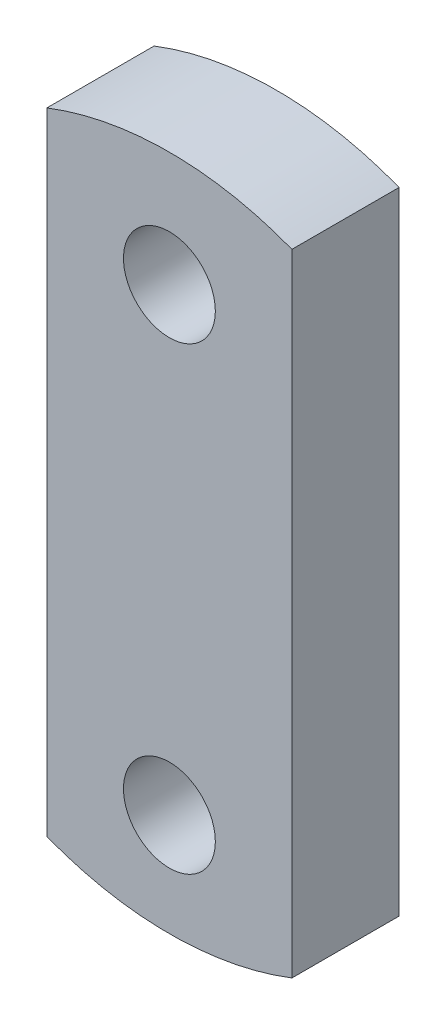
ISO-10303-21;
HEADER;
FILE_DESCRIPTION(('STEP AP214'),'2;1');
FILE_NAME('part.step','',(''),(''),'','','');
FILE_SCHEMA(('AUTOMOTIVE_DESIGN { 1 0 10303 214 1 1 1 1 }'));
ENDSEC;
DATA;
#1=APPLICATION_CONTEXT('core data for automotive mechanical design processes');
#2=APPLICATION_PROTOCOL_DEFINITION('international standard','automotive_design',2000,#1);
#3=PRODUCT_CONTEXT('',#1,'mechanical');
#4=PRODUCT('Part','Part','',(#3));
#5=PRODUCT_RELATED_PRODUCT_CATEGORY('part','',(#4));
#6=PRODUCT_DEFINITION_FORMATION('','',#4);
#7=PRODUCT_DEFINITION_CONTEXT('part definition',#1,'design');
#8=PRODUCT_DEFINITION('design','',#6,#7);
#9=PRODUCT_DEFINITION_SHAPE('','',#8);
#10=(LENGTH_UNIT() NAMED_UNIT(*) SI_UNIT(.MILLI.,.METRE.));
#11=(NAMED_UNIT(*) PLANE_ANGLE_UNIT() SI_UNIT($,.RADIAN.));
#12=(NAMED_UNIT(*) SI_UNIT($,.STERADIAN.) SOLID_ANGLE_UNIT());
#13=UNCERTAINTY_MEASURE_WITH_UNIT(LENGTH_MEASURE(1.E-05),#10,'distance_accuracy_value','');
#14=(GEOMETRIC_REPRESENTATION_CONTEXT(3) GLOBAL_UNCERTAINTY_ASSIGNED_CONTEXT((#13)) GLOBAL_UNIT_ASSIGNED_CONTEXT((#10,
#11,#12)) REPRESENTATION_CONTEXT('',''));
#15=CARTESIAN_POINT('',(0.,0.,0.));
#16=DIRECTION('',(0.,0.,1.));
#17=DIRECTION('',(1.,0.,0.));
#18=AXIS2_PLACEMENT_3D('',#15,#16,#17);
#19=CARTESIAN_POINT('',(0.,1.96104917592106,35.));
#20=DIRECTION('',(0.,0.,-1.));
#21=DIRECTION('',(-1.,0.,0.));
#22=AXIS2_PLACEMENT_3D('',#19,#20,#21);
#23=CYLINDRICAL_SURFACE('',#22,110.524602311905);
#24=CARTESIAN_POINT('',(0.,1.96104917592106,0.));
#25=DIRECTION('',(0.,0.,1.));
#26=DIRECTION('',(1.,0.,0.));
#27=AXIS2_PLACEMENT_3D('',#24,#25,#26);
#28=CIRCLE('',#27,110.524602311905);
#29=CARTESIAN_POINT('',(-40.,-101.071410351186,0.));
#30=VERTEX_POINT('',#29);
#31=CARTESIAN_POINT('',(40.,-101.071410351185,0.));
#32=VERTEX_POINT('',#31);
#33=EDGE_CURVE('E102',#30,#32,#28,.T.);
#34=ORIENTED_EDGE('',*,*,#33,.T.);
#35=DIRECTION('',(0.,0.,-1.));
#36=VECTOR('',#35,1.);
#37=CARTESIAN_POINT('',(40.,-101.071410351185,35.));
#38=LINE('',#37,#36);
#39=CARTESIAN_POINT('',(40.,-101.071410351185,35.));
#40=VERTEX_POINT('',#39);
#41=EDGE_CURVE('E11',#40,#32,#38,.T.);
#42=ORIENTED_EDGE('',*,*,#41,.F.);
#43=CARTESIAN_POINT('',(0.,1.96104917592106,35.));
#44=DIRECTION('',(0.,0.,1.));
#45=DIRECTION('',(1.,0.,0.));
#46=AXIS2_PLACEMENT_3D('',#43,#44,#45);
#47=CIRCLE('',#46,110.524602311905);
#48=CARTESIAN_POINT('',(-40.,-101.071410351186,35.));
#49=VERTEX_POINT('',#48);
#50=EDGE_CURVE('E89',#49,#40,#47,.T.);
#51=ORIENTED_EDGE('',*,*,#50,.F.);
#52=DIRECTION('',(0.,0.,-1.));
#53=VECTOR('',#52,1.);
#54=CARTESIAN_POINT('',(-40.,-101.071410351186,35.));
#55=LINE('',#54,#53);
#56=EDGE_CURVE('E98',#49,#30,#55,.T.);
#57=ORIENTED_EDGE('',*,*,#56,.T.);
#58=EDGE_LOOP('',(#34,#42,#51,#57));
#59=FACE_BOUND('',#58,.T.);
#60=ADVANCED_FACE('F36',(#59),#23,.T.);
#61=CARTESIAN_POINT('',(40.,104.993508703028,35.));
#62=DIRECTION('',(-1.,0.,0.));
#63=DIRECTION('',(0.,-1.,0.));
#64=AXIS2_PLACEMENT_3D('',#61,#62,#63);
#65=PLANE('',#64);
#66=DIRECTION('',(0.,1.,0.));
#67=VECTOR('',#66,1.);
#68=CARTESIAN_POINT('',(40.,104.993508703028,0.));
#69=LINE('',#68,#67);
#70=CARTESIAN_POINT('',(40.,104.993508703028,0.));
#71=VERTEX_POINT('',#70);
#72=EDGE_CURVE('E93',#32,#71,#69,.T.);
#73=ORIENTED_EDGE('',*,*,#72,.T.);
#74=DIRECTION('',(0.,0.,-1.));
#75=VECTOR('',#74,1.);
#76=CARTESIAN_POINT('',(40.,104.993508703028,35.));
#77=LINE('',#76,#75);
#78=CARTESIAN_POINT('',(40.,104.993508703028,35.));
#79=VERTEX_POINT('',#78);
#80=EDGE_CURVE('E45',#79,#71,#77,.T.);
#81=ORIENTED_EDGE('',*,*,#80,.F.);
#82=DIRECTION('',(0.,1.,0.));
#83=VECTOR('',#82,1.);
#84=CARTESIAN_POINT('',(40.,104.993508703028,35.));
#85=LINE('',#84,#83);
#86=EDGE_CURVE('E84',#40,#79,#85,.T.);
#87=ORIENTED_EDGE('',*,*,#86,.F.);
#88=ORIENTED_EDGE('',*,*,#41,.T.);
#89=EDGE_LOOP('',(#73,#81,#87,#88));
#90=FACE_BOUND('',#89,.T.);
#91=ADVANCED_FACE('F92',(#90),#65,.F.);
#92=CARTESIAN_POINT('',(0.,1.96104917592106,35.));
#93=DIRECTION('',(0.,0.,-1.));
#94=DIRECTION('',(-1.,0.,0.));
#95=AXIS2_PLACEMENT_3D('',#92,#93,#94);
#96=CYLINDRICAL_SURFACE('',#95,110.524602311905);
#97=CARTESIAN_POINT('',(0.,1.96104917592106,0.));
#98=DIRECTION('',(0.,0.,1.));
#99=DIRECTION('',(1.,0.,0.));
#100=AXIS2_PLACEMENT_3D('',#97,#98,#99);
#101=CIRCLE('',#100,110.524602311905);
#102=CARTESIAN_POINT('',(-40.,104.993508703028,0.));
#103=VERTEX_POINT('',#102);
#104=EDGE_CURVE('E71',#71,#103,#101,.T.);
#105=ORIENTED_EDGE('',*,*,#104,.T.);
#106=DIRECTION('',(0.,0.,-1.));
#107=VECTOR('',#106,1.);
#108=CARTESIAN_POINT('',(-40.,104.993508703028,35.));
#109=LINE('',#108,#107);
#110=CARTESIAN_POINT('',(-40.,104.993508703028,35.));
#111=VERTEX_POINT('',#110);
#112=EDGE_CURVE('E94',#111,#103,#109,.T.);
#113=ORIENTED_EDGE('',*,*,#112,.F.);
#114=CARTESIAN_POINT('',(0.,1.96104917592106,35.));
#115=DIRECTION('',(0.,0.,1.));
#116=DIRECTION('',(1.,0.,0.));
#117=AXIS2_PLACEMENT_3D('',#114,#115,#116);
#118=CIRCLE('',#117,110.524602311905);
#119=EDGE_CURVE('E87',#79,#111,#118,.T.);
#120=ORIENTED_EDGE('',*,*,#119,.F.);
#121=ORIENTED_EDGE('',*,*,#80,.T.);
#122=EDGE_LOOP('',(#105,#113,#120,#121));
#123=FACE_BOUND('',#122,.T.);
#124=ADVANCED_FACE('F96',(#123),#96,.T.);
#125=CARTESIAN_POINT('',(-40.,-101.071410351186,35.));
#126=DIRECTION('',(1.,0.,0.));
#127=DIRECTION('',(0.,1.,0.));
#128=AXIS2_PLACEMENT_3D('',#125,#126,#127);
#129=PLANE('',#128);
#130=DIRECTION('',(0.,-1.,0.));
#131=VECTOR('',#130,1.);
#132=CARTESIAN_POINT('',(-40.,-101.071410351186,0.));
#133=LINE('',#132,#131);
#134=EDGE_CURVE('E77',#103,#30,#133,.T.);
#135=ORIENTED_EDGE('',*,*,#134,.T.);
#136=ORIENTED_EDGE('',*,*,#56,.F.);
#137=DIRECTION('',(0.,-1.,0.));
#138=VECTOR('',#137,1.);
#139=CARTESIAN_POINT('',(-40.,-101.071410351186,35.));
#140=LINE('',#139,#138);
#141=EDGE_CURVE('E54',#111,#49,#140,.T.);
#142=ORIENTED_EDGE('',*,*,#141,.F.);
#143=ORIENTED_EDGE('',*,*,#112,.T.);
#144=EDGE_LOOP('',(#135,#136,#142,#143));
#145=FACE_BOUND('',#144,.T.);
#146=ADVANCED_FACE('F130',(#145),#129,.F.);
#147=CARTESIAN_POINT('',(0.,1.96104917592106,35.));
#148=DIRECTION('',(0.,0.,1.));
#149=DIRECTION('',(1.,0.,0.));
#150=AXIS2_PLACEMENT_3D('',#147,#148,#149);
#151=PLANE('',#150);
#152=CARTESIAN_POINT('',(0.,-75.0064912969723,35.));
#153=DIRECTION('',(0.,0.,1.));
#154=DIRECTION('',(1.,0.,0.));
#155=AXIS2_PLACEMENT_3D('',#152,#153,#154);
#156=CIRCLE('',#155,15.);
#157=CARTESIAN_POINT('',(15.,-75.0064912969723,35.));
#158=VERTEX_POINT('',#157);
#159=EDGE_CURVE('E119',#158,#158,#156,.T.);
#160=ORIENTED_EDGE('',*,*,#159,.F.);
#161=EDGE_LOOP('',(#160));
#162=FACE_BOUND('',#161,.T.);
#163=CARTESIAN_POINT('',(0.,74.9935087030276,35.));
#164=DIRECTION('',(0.,0.,1.));
#165=DIRECTION('',(1.,0.,0.));
#166=AXIS2_PLACEMENT_3D('',#163,#164,#165);
#167=CIRCLE('',#166,15.);
#168=CARTESIAN_POINT('',(15.,74.9935087030276,35.));
#169=VERTEX_POINT('',#168);
#170=EDGE_CURVE('E111',#169,#169,#167,.T.);
#171=ORIENTED_EDGE('',*,*,#170,.F.);
#172=EDGE_LOOP('',(#171));
#173=FACE_BOUND('',#172,.T.);
#174=ORIENTED_EDGE('',*,*,#50,.T.);
#175=ORIENTED_EDGE('',*,*,#86,.T.);
#176=ORIENTED_EDGE('',*,*,#119,.T.);
#177=ORIENTED_EDGE('',*,*,#141,.T.);
#178=EDGE_LOOP('',(#174,#175,#176,#177));
#179=FACE_BOUND('',#178,.T.);
#180=ADVANCED_FACE('F85',(#162,#173,#179),#151,.T.);
#181=CARTESIAN_POINT('',(0.,1.96104917592106,0.));
#182=DIRECTION('',(0.,0.,1.));
#183=DIRECTION('',(1.,0.,0.));
#184=AXIS2_PLACEMENT_3D('',#181,#182,#183);
#185=PLANE('',#184);
#186=CARTESIAN_POINT('',(0.,-75.0064912969723,0.));
#187=DIRECTION('',(0.,0.,1.));
#188=DIRECTION('',(1.,0.,0.));
#189=AXIS2_PLACEMENT_3D('',#186,#187,#188);
#190=CIRCLE('',#189,15.);
#191=CARTESIAN_POINT('',(15.,-75.0064912969723,0.));
#192=VERTEX_POINT('',#191);
#193=EDGE_CURVE('E39',#192,#192,#190,.T.);
#194=ORIENTED_EDGE('',*,*,#193,.T.);
#195=EDGE_LOOP('',(#194));
#196=FACE_BOUND('',#195,.T.);
#197=CARTESIAN_POINT('',(0.,74.9935087030276,0.));
#198=DIRECTION('',(0.,0.,1.));
#199=DIRECTION('',(1.,0.,0.));
#200=AXIS2_PLACEMENT_3D('',#197,#198,#199);
#201=CIRCLE('',#200,15.);
#202=CARTESIAN_POINT('',(15.,74.9935087030276,0.));
#203=VERTEX_POINT('',#202);
#204=EDGE_CURVE('E105',#203,#203,#201,.T.);
#205=ORIENTED_EDGE('',*,*,#204,.T.);
#206=EDGE_LOOP('',(#205));
#207=FACE_BOUND('',#206,.T.);
#208=ORIENTED_EDGE('',*,*,#33,.F.);
#209=ORIENTED_EDGE('',*,*,#134,.F.);
#210=ORIENTED_EDGE('',*,*,#104,.F.);
#211=ORIENTED_EDGE('',*,*,#72,.F.);
#212=EDGE_LOOP('',(#208,#209,#210,#211));
#213=FACE_BOUND('',#212,.T.);
#214=ADVANCED_FACE('F129',(#196,#207,#213),#185,.F.);
#215=CARTESIAN_POINT('',(0.,74.9935087030276,-1.2E-05));
#216=DIRECTION('',(0.,0.,1.));
#217=DIRECTION('',(1.,0.,0.));
#218=AXIS2_PLACEMENT_3D('',#215,#216,#217);
#219=CYLINDRICAL_SURFACE('',#218,15.);
#220=CARTESIAN_POINT('',(15.,74.9935087030276,35.));
#221=CARTESIAN_POINT('',(15.,74.9935087030276,34.6354166666667));
#222=CARTESIAN_POINT('',(15.,74.9935087030276,34.2708333333333));
#223=CARTESIAN_POINT('',(15.,74.9935087030276,33.5416666666667));
#224=CARTESIAN_POINT('',(15.,74.9935087030276,33.1770833333333));
#225=CARTESIAN_POINT('',(15.,74.9935087030276,32.4479166666667));
#226=CARTESIAN_POINT('',(15.,74.9935087030276,32.0833333333333));
#227=CARTESIAN_POINT('',(15.,74.9935087030276,31.3541666666667));
#228=CARTESIAN_POINT('',(15.,74.9935087030276,30.9895833333333));
#229=CARTESIAN_POINT('',(15.,74.9935087030276,30.2604166666667));
#230=CARTESIAN_POINT('',(15.,74.9935087030276,29.8958333333333));
#231=CARTESIAN_POINT('',(15.,74.9935087030276,29.1666666666667));
#232=CARTESIAN_POINT('',(15.,74.9935087030276,28.8020833333333));
#233=CARTESIAN_POINT('',(15.,74.9935087030276,28.0729166666667));
#234=CARTESIAN_POINT('',(15.,74.9935087030276,27.7083333333333));
#235=CARTESIAN_POINT('',(15.,74.9935087030276,26.9791666666667));
#236=CARTESIAN_POINT('',(15.,74.9935087030276,26.6145833333333));
#237=CARTESIAN_POINT('',(15.,74.9935087030276,25.8854166666667));
#238=CARTESIAN_POINT('',(15.,74.9935087030276,25.5208333333333));
#239=CARTESIAN_POINT('',(15.,74.9935087030276,24.7916666666667));
#240=CARTESIAN_POINT('',(15.,74.9935087030276,24.4270833333333));
#241=CARTESIAN_POINT('',(15.,74.9935087030276,23.6979166666667));
#242=CARTESIAN_POINT('',(15.,74.9935087030276,23.3333333333333));
#243=CARTESIAN_POINT('',(15.,74.9935087030276,22.6041666666667));
#244=CARTESIAN_POINT('',(15.,74.9935087030276,22.2395833333333));
#245=CARTESIAN_POINT('',(15.,74.9935087030276,21.5104166666667));
#246=CARTESIAN_POINT('',(15.,74.9935087030276,21.1458333333333));
#247=CARTESIAN_POINT('',(15.,74.9935087030276,20.4166666666667));
#248=CARTESIAN_POINT('',(15.,74.9935087030276,20.0520833333333));
#249=CARTESIAN_POINT('',(15.,74.9935087030276,19.3229166666667));
#250=CARTESIAN_POINT('',(15.,74.9935087030276,18.9583333333333));
#251=CARTESIAN_POINT('',(15.,74.9935087030276,18.2291666666667));
#252=CARTESIAN_POINT('',(15.,74.9935087030276,17.8645833333333));
#253=CARTESIAN_POINT('',(15.,74.9935087030276,17.1354166666667));
#254=CARTESIAN_POINT('',(15.,74.9935087030276,16.7708333333333));
#255=CARTESIAN_POINT('',(15.,74.9935087030276,16.0416666666667));
#256=CARTESIAN_POINT('',(15.,74.9935087030276,15.6770833333333));
#257=CARTESIAN_POINT('',(15.,74.9935087030276,14.9479166666667));
#258=CARTESIAN_POINT('',(15.,74.9935087030276,14.5833333333333));
#259=CARTESIAN_POINT('',(15.,74.9935087030276,13.8541666666667));
#260=CARTESIAN_POINT('',(15.,74.9935087030276,13.4895833333333));
#261=CARTESIAN_POINT('',(15.,74.9935087030276,12.7604166666667));
#262=CARTESIAN_POINT('',(15.,74.9935087030276,12.3958333333333));
#263=CARTESIAN_POINT('',(15.,74.9935087030276,11.6666666666667));
#264=CARTESIAN_POINT('',(15.,74.9935087030276,11.3020833333333));
#265=CARTESIAN_POINT('',(15.,74.9935087030276,10.5729166666667));
#266=CARTESIAN_POINT('',(15.,74.9935087030276,10.2083333333333));
#267=CARTESIAN_POINT('',(15.,74.9935087030276,9.47916666666667));
#268=CARTESIAN_POINT('',(15.,74.9935087030276,9.11458333333333));
#269=CARTESIAN_POINT('',(15.,74.9935087030276,8.38541666666667));
#270=CARTESIAN_POINT('',(15.,74.9935087030276,8.02083333333333));
#271=CARTESIAN_POINT('',(15.,74.9935087030276,7.29166666666667));
#272=CARTESIAN_POINT('',(15.,74.9935087030276,6.92708333333334));
#273=CARTESIAN_POINT('',(15.,74.9935087030276,6.19791666666667));
#274=CARTESIAN_POINT('',(15.,74.9935087030276,5.83333333333334));
#275=CARTESIAN_POINT('',(15.,74.9935087030276,5.10416666666667));
#276=CARTESIAN_POINT('',(15.,74.9935087030276,4.73958333333333));
#277=CARTESIAN_POINT('',(15.,74.9935087030276,4.01041666666667));
#278=CARTESIAN_POINT('',(15.,74.9935087030276,3.64583333333333));
#279=CARTESIAN_POINT('',(15.,74.9935087030276,2.91666666666667));
#280=CARTESIAN_POINT('',(15.,74.9935087030276,2.55208333333333));
#281=CARTESIAN_POINT('',(15.,74.9935087030276,1.82291666666667));
#282=CARTESIAN_POINT('',(15.,74.9935087030276,1.45833333333333));
#283=CARTESIAN_POINT('',(15.,74.9935087030276,0.729166666666666));
#284=CARTESIAN_POINT('',(15.,74.9935087030276,0.364583333333334));
#285=CARTESIAN_POINT('',(15.,74.9935087030276,0.));
#286=B_SPLINE_CURVE_WITH_KNOTS('',3,(#220,#221,#222,#223,#224,#225,#226,#227,#228,#229,#230,
#231,#232,#233,#234,#235,#236,#237,#238,#239,#240,#241,#242,#243,#244,#245,#246,#247,#248,#249,
#250,#251,#252,#253,#254,#255,#256,#257,#258,#259,#260,#261,#262,#263,#264,#265,#266,#267,#268,
#269,#270,#271,#272,#273,#274,#275,#276,#277,#278,#279,#280,#281,#282,#283,#284,#285),
.UNSPECIFIED.,.F.,.F.,(4,2,2,2,2,2,2,2,2,2,2,2,2,2,2,2,2,2,2,2,2,2,2,2,2,2,2,2,2,2,2,2,4),(0.,
1.09375,2.1875,3.28125,4.375,5.46875,6.5625,7.65625,8.75,9.84375,10.9375,12.03125,13.125,
14.21875,15.3125,16.40625,17.5,18.59375,19.6875,20.78125,21.875,22.96875,24.0625,25.15625,26.25,
27.34375,28.4375,29.53125,30.625,31.71875,32.8125,33.90625,35.),.UNSPECIFIED.);
#287=EDGE_CURVE('BSEAM136',#169,#203,#286,.T.);
#288=ORIENTED_EDGE('',*,*,#170,.T.);
#289=ORIENTED_EDGE('',*,*,#204,.F.);
#290=ORIENTED_EDGE('',*,*,#287,.T.);
#291=ORIENTED_EDGE('',*,*,#287,.F.);
#292=EDGE_LOOP('',(#288,#290,#289,#291));
#293=FACE_BOUND('',#292,.T.);
#294=ADVANCED_FACE('F136',(#293),#219,.F.);
#295=CARTESIAN_POINT('',(0.,-75.0064912969723,-1.2E-05));
#296=DIRECTION('',(0.,0.,1.));
#297=DIRECTION('',(1.,0.,0.));
#298=AXIS2_PLACEMENT_3D('',#295,#296,#297);
#299=CYLINDRICAL_SURFACE('',#298,15.);
#300=CARTESIAN_POINT('',(15.,-75.0064912969723,35.));
#301=CARTESIAN_POINT('',(15.,-75.0064912969723,34.6354166666667));
#302=CARTESIAN_POINT('',(15.,-75.0064912969723,34.2708333333333));
#303=CARTESIAN_POINT('',(15.,-75.0064912969723,33.5416666666667));
#304=CARTESIAN_POINT('',(15.,-75.0064912969723,33.1770833333333));
#305=CARTESIAN_POINT('',(15.,-75.0064912969723,32.4479166666667));
#306=CARTESIAN_POINT('',(15.,-75.0064912969723,32.0833333333333));
#307=CARTESIAN_POINT('',(15.,-75.0064912969723,31.3541666666667));
#308=CARTESIAN_POINT('',(15.,-75.0064912969723,30.9895833333333));
#309=CARTESIAN_POINT('',(15.,-75.0064912969723,30.2604166666667));
#310=CARTESIAN_POINT('',(15.,-75.0064912969723,29.8958333333333));
#311=CARTESIAN_POINT('',(15.,-75.0064912969723,29.1666666666667));
#312=CARTESIAN_POINT('',(15.,-75.0064912969723,28.8020833333333));
#313=CARTESIAN_POINT('',(15.,-75.0064912969723,28.0729166666667));
#314=CARTESIAN_POINT('',(15.,-75.0064912969723,27.7083333333333));
#315=CARTESIAN_POINT('',(15.,-75.0064912969723,26.9791666666667));
#316=CARTESIAN_POINT('',(15.,-75.0064912969723,26.6145833333333));
#317=CARTESIAN_POINT('',(15.,-75.0064912969723,25.8854166666667));
#318=CARTESIAN_POINT('',(15.,-75.0064912969723,25.5208333333333));
#319=CARTESIAN_POINT('',(15.,-75.0064912969723,24.7916666666667));
#320=CARTESIAN_POINT('',(15.,-75.0064912969723,24.4270833333333));
#321=CARTESIAN_POINT('',(15.,-75.0064912969723,23.6979166666667));
#322=CARTESIAN_POINT('',(15.,-75.0064912969723,23.3333333333333));
#323=CARTESIAN_POINT('',(15.,-75.0064912969723,22.6041666666667));
#324=CARTESIAN_POINT('',(15.,-75.0064912969723,22.2395833333333));
#325=CARTESIAN_POINT('',(15.,-75.0064912969723,21.5104166666667));
#326=CARTESIAN_POINT('',(15.,-75.0064912969723,21.1458333333333));
#327=CARTESIAN_POINT('',(15.,-75.0064912969723,20.4166666666667));
#328=CARTESIAN_POINT('',(15.,-75.0064912969723,20.0520833333333));
#329=CARTESIAN_POINT('',(15.,-75.0064912969723,19.3229166666667));
#330=CARTESIAN_POINT('',(15.,-75.0064912969723,18.9583333333333));
#331=CARTESIAN_POINT('',(15.,-75.0064912969723,18.2291666666667));
#332=CARTESIAN_POINT('',(15.,-75.0064912969723,17.8645833333333));
#333=CARTESIAN_POINT('',(15.,-75.0064912969723,17.1354166666667));
#334=CARTESIAN_POINT('',(15.,-75.0064912969723,16.7708333333333));
#335=CARTESIAN_POINT('',(15.,-75.0064912969723,16.0416666666667));
#336=CARTESIAN_POINT('',(15.,-75.0064912969723,15.6770833333333));
#337=CARTESIAN_POINT('',(15.,-75.0064912969723,14.9479166666667));
#338=CARTESIAN_POINT('',(15.,-75.0064912969723,14.5833333333333));
#339=CARTESIAN_POINT('',(15.,-75.0064912969723,13.8541666666667));
#340=CARTESIAN_POINT('',(15.,-75.0064912969723,13.4895833333333));
#341=CARTESIAN_POINT('',(15.,-75.0064912969723,12.7604166666667));
#342=CARTESIAN_POINT('',(15.,-75.0064912969723,12.3958333333333));
#343=CARTESIAN_POINT('',(15.,-75.0064912969723,11.6666666666667));
#344=CARTESIAN_POINT('',(15.,-75.0064912969723,11.3020833333333));
#345=CARTESIAN_POINT('',(15.,-75.0064912969723,10.5729166666667));
#346=CARTESIAN_POINT('',(15.,-75.0064912969723,10.2083333333333));
#347=CARTESIAN_POINT('',(15.,-75.0064912969723,9.47916666666667));
#348=CARTESIAN_POINT('',(15.,-75.0064912969723,9.11458333333333));
#349=CARTESIAN_POINT('',(15.,-75.0064912969723,8.38541666666667));
#350=CARTESIAN_POINT('',(15.,-75.0064912969723,8.02083333333333));
#351=CARTESIAN_POINT('',(15.,-75.0064912969723,7.29166666666667));
#352=CARTESIAN_POINT('',(15.,-75.0064912969723,6.92708333333334));
#353=CARTESIAN_POINT('',(15.,-75.0064912969723,6.19791666666667));
#354=CARTESIAN_POINT('',(15.,-75.0064912969723,5.83333333333334));
#355=CARTESIAN_POINT('',(15.,-75.0064912969723,5.10416666666667));
#356=CARTESIAN_POINT('',(15.,-75.0064912969723,4.73958333333333));
#357=CARTESIAN_POINT('',(15.,-75.0064912969723,4.01041666666667));
#358=CARTESIAN_POINT('',(15.,-75.0064912969723,3.64583333333333));
#359=CARTESIAN_POINT('',(15.,-75.0064912969723,2.91666666666667));
#360=CARTESIAN_POINT('',(15.,-75.0064912969723,2.55208333333333));
#361=CARTESIAN_POINT('',(15.,-75.0064912969723,1.82291666666667));
#362=CARTESIAN_POINT('',(15.,-75.0064912969723,1.45833333333333));
#363=CARTESIAN_POINT('',(15.,-75.0064912969723,0.729166666666666));
#364=CARTESIAN_POINT('',(15.,-75.0064912969723,0.364583333333334));
#365=CARTESIAN_POINT('',(15.,-75.0064912969723,0.));
#366=B_SPLINE_CURVE_WITH_KNOTS('',3,(#300,#301,#302,#303,#304,#305,#306,#307,#308,#309,#310,
#311,#312,#313,#314,#315,#316,#317,#318,#319,#320,#321,#322,#323,#324,#325,#326,#327,#328,#329,
#330,#331,#332,#333,#334,#335,#336,#337,#338,#339,#340,#341,#342,#343,#344,#345,#346,#347,#348,
#349,#350,#351,#352,#353,#354,#355,#356,#357,#358,#359,#360,#361,#362,#363,#364,#365),
.UNSPECIFIED.,.F.,.F.,(4,2,2,2,2,2,2,2,2,2,2,2,2,2,2,2,2,2,2,2,2,2,2,2,2,2,2,2,2,2,2,2,4),(0.,
1.09375,2.1875,3.28125,4.375,5.46875,6.5625,7.65625,8.75,9.84375,10.9375,12.03125,13.125,
14.21875,15.3125,16.40625,17.5,18.59375,19.6875,20.78125,21.875,22.96875,24.0625,25.15625,26.25,
27.34375,28.4375,29.53125,30.625,31.71875,32.8125,33.90625,35.),.UNSPECIFIED.);
#367=EDGE_CURVE('BSEAM124',#158,#192,#366,.T.);
#368=ORIENTED_EDGE('',*,*,#159,.T.);
#369=ORIENTED_EDGE('',*,*,#193,.F.);
#370=ORIENTED_EDGE('',*,*,#367,.T.);
#371=ORIENTED_EDGE('',*,*,#367,.F.);
#372=EDGE_LOOP('',(#368,#370,#369,#371));
#373=FACE_BOUND('',#372,.T.);
#374=ADVANCED_FACE('F124',(#373),#299,.F.);
#375=CLOSED_SHELL('',(#60,#91,#124,#146,#180,#214,#294,#374));
#376=MANIFOLD_SOLID_BREP('B2',#375);
#377=ADVANCED_BREP_SHAPE_REPRESENTATION('',(#18,#376),#14);
#378=SHAPE_DEFINITION_REPRESENTATION(#9,#377);
ENDSEC;
END-ISO-10303-21;
